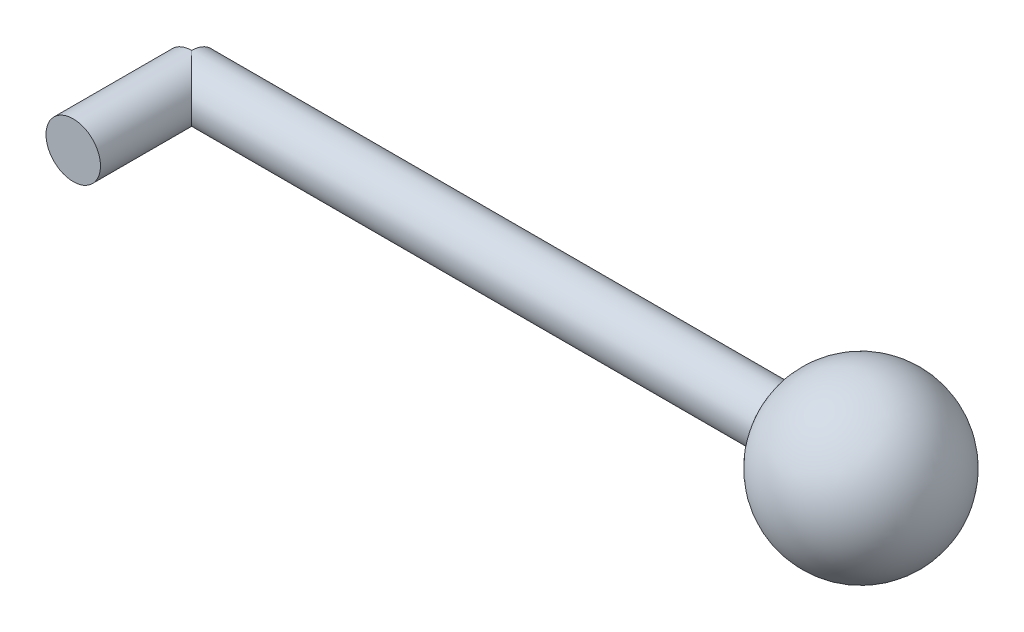
ISO-10303-21;
HEADER;
FILE_DESCRIPTION(('STEP AP214'),'2;1');
FILE_NAME('part.step','',(''),(''),'','','');
FILE_SCHEMA(('AUTOMOTIVE_DESIGN { 1 0 10303 214 1 1 1 1 }'));
ENDSEC;
DATA;
#1=APPLICATION_CONTEXT('core data for automotive mechanical design processes');
#2=APPLICATION_PROTOCOL_DEFINITION('international standard','automotive_design',2000,#1);
#3=PRODUCT_CONTEXT('',#1,'mechanical');
#4=PRODUCT('Part','Part','',(#3));
#5=PRODUCT_RELATED_PRODUCT_CATEGORY('part','',(#4));
#6=PRODUCT_DEFINITION_FORMATION('','',#4);
#7=PRODUCT_DEFINITION_CONTEXT('part definition',#1,'design');
#8=PRODUCT_DEFINITION('design','',#6,#7);
#9=PRODUCT_DEFINITION_SHAPE('','',#8);
#10=(LENGTH_UNIT() NAMED_UNIT(*) SI_UNIT(.MILLI.,.METRE.));
#11=(NAMED_UNIT(*) PLANE_ANGLE_UNIT() SI_UNIT($,.RADIAN.));
#12=(NAMED_UNIT(*) SI_UNIT($,.STERADIAN.) SOLID_ANGLE_UNIT());
#13=UNCERTAINTY_MEASURE_WITH_UNIT(LENGTH_MEASURE(1.E-05),#10,'distance_accuracy_value','');
#14=(GEOMETRIC_REPRESENTATION_CONTEXT(3) GLOBAL_UNCERTAINTY_ASSIGNED_CONTEXT((#13)) GLOBAL_UNIT_ASSIGNED_CONTEXT((#10,
#11,#12)) REPRESENTATION_CONTEXT('',''));
#15=CARTESIAN_POINT('',(0.,0.,0.));
#16=DIRECTION('',(0.,0.,1.));
#17=DIRECTION('',(1.,0.,0.));
#18=AXIS2_PLACEMENT_3D('',#15,#16,#17);
#19=CARTESIAN_POINT('',(565.,0.,0.));
#20=DIRECTION('',(-1.,0.,0.));
#21=DIRECTION('',(0.,0.,1.));
#22=AXIS2_PLACEMENT_3D('',#19,#20,#21);
#23=CYLINDRICAL_SURFACE('',#22,23.);
#24=CARTESIAN_POINT('',(0.,0.,0.));
#25=DIRECTION('',(-0.707106781186547,0.,0.707106781186547));
#26=DIRECTION('',(-0.707106781186547,0.,-0.707106781186547));
#27=AXIS2_PLACEMENT_3D('',#24,#25,#26);
#28=ELLIPSE('',#27,32.5269119345812,23.);
#29=CARTESIAN_POINT('',(0.,-23.,0.));
#30=VERTEX_POINT('',#29);
#31=CARTESIAN_POINT('',(0.,23.,0.));
#32=VERTEX_POINT('',#31);
#33=EDGE_CURVE('E60',#30,#32,#28,.T.);
#34=ORIENTED_EDGE('',*,*,#33,.F.);
#35=CARTESIAN_POINT('',(0.,0.,0.));
#36=DIRECTION('',(1.,0.,0.));
#37=DIRECTION('',(0.,0.,-1.));
#38=AXIS2_PLACEMENT_3D('',#35,#36,#37);
#39=CIRCLE('',#38,23.);
#40=EDGE_CURVE('E54',#30,#32,#39,.T.);
#41=ORIENTED_EDGE('',*,*,#40,.T.);
#42=EDGE_LOOP('',(#34,#41));
#43=FACE_BOUND('',#42,.T.);
#44=CARTESIAN_POINT('',(498.886461295737,0.,0.));
#45=DIRECTION('',(1.,0.,0.));
#46=DIRECTION('',(0.,0.,-1.));
#47=AXIS2_PLACEMENT_3D('',#44,#45,#46);
#48=CIRCLE('',#47,23.);
#49=CARTESIAN_POINT('',(498.886461295737,0.,-23.));
#50=VERTEX_POINT('',#49);
#51=EDGE_CURVE('E11',#50,#50,#48,.T.);
#52=ORIENTED_EDGE('',*,*,#51,.F.);
#53=EDGE_LOOP('',(#52));
#54=FACE_BOUND('',#53,.T.);
#55=ADVANCED_FACE('F39',(#43,#54),#23,.T.);
#56=CARTESIAN_POINT('',(0.,0.,0.));
#57=DIRECTION('',(1.,0.,0.));
#58=DIRECTION('',(0.,0.,-1.));
#59=AXIS2_PLACEMENT_3D('',#56,#57,#58);
#60=PLANE('',#59);
#61=DIRECTION('',(0.,-1.,0.));
#62=VECTOR('',#61,1.);
#63=CARTESIAN_POINT('',(0.,0.,0.));
#64=LINE('',#63,#62);
#65=EDGE_CURVE('E47',#32,#30,#64,.T.);
#66=ORIENTED_EDGE('',*,*,#65,.F.);
#67=ORIENTED_EDGE('',*,*,#40,.F.);
#68=EDGE_LOOP('',(#66,#67));
#69=FACE_BOUND('',#68,.T.);
#70=ADVANCED_FACE('F56',(#69),#60,.F.);
#71=CARTESIAN_POINT('',(0.,0.,100.));
#72=DIRECTION('',(0.,0.,-1.));
#73=DIRECTION('',(-1.,0.,0.));
#74=AXIS2_PLACEMENT_3D('',#71,#72,#73);
#75=CYLINDRICAL_SURFACE('',#74,23.);
#76=CARTESIAN_POINT('',(0.,0.,100.));
#77=DIRECTION('',(0.,0.,1.));
#78=DIRECTION('',(1.,0.,0.));
#79=AXIS2_PLACEMENT_3D('',#76,#77,#78);
#80=CIRCLE('',#79,23.);
#81=CARTESIAN_POINT('',(23.,0.,100.));
#82=VERTEX_POINT('',#81);
#83=EDGE_CURVE('E67',#82,#82,#80,.T.);
#84=ORIENTED_EDGE('',*,*,#83,.F.);
#85=EDGE_LOOP('',(#84));
#86=FACE_BOUND('',#85,.T.);
#87=CARTESIAN_POINT('',(0.,0.,0.));
#88=DIRECTION('',(0.,0.,1.));
#89=DIRECTION('',(1.,0.,0.));
#90=AXIS2_PLACEMENT_3D('',#87,#88,#89);
#91=CIRCLE('',#90,23.);
#92=EDGE_CURVE('E71',#32,#30,#91,.T.);
#93=ORIENTED_EDGE('',*,*,#92,.T.);
#94=ORIENTED_EDGE('',*,*,#33,.T.);
#95=EDGE_LOOP('',(#93,#94));
#96=FACE_BOUND('',#95,.T.);
#97=ADVANCED_FACE('F73',(#86,#96),#75,.T.);
#98=CARTESIAN_POINT('',(0.,0.,0.));
#99=DIRECTION('',(0.,0.,1.));
#100=DIRECTION('',(1.,0.,0.));
#101=AXIS2_PLACEMENT_3D('',#98,#99,#100);
#102=PLANE('',#101);
#103=ORIENTED_EDGE('',*,*,#92,.F.);
#104=ORIENTED_EDGE('',*,*,#65,.T.);
#105=EDGE_LOOP('',(#103,#104));
#106=FACE_BOUND('',#105,.T.);
#107=ADVANCED_FACE('F70',(#106),#102,.F.);
#108=CARTESIAN_POINT('',(0.,0.,100.));
#109=DIRECTION('',(0.,0.,1.));
#110=DIRECTION('',(1.,0.,0.));
#111=AXIS2_PLACEMENT_3D('',#108,#109,#110);
#112=PLANE('',#111);
#113=ORIENTED_EDGE('',*,*,#83,.T.);
#114=EDGE_LOOP('',(#113));
#115=FACE_BOUND('',#114,.T.);
#116=ADVANCED_FACE('F81',(#115),#112,.T.);
#117=CARTESIAN_POINT('',(565.,0.,0.));
#118=DIRECTION('',(1.,0.,0.));
#119=DIRECTION('',(0.,-1.,0.));
#120=AXIS2_PLACEMENT_3D('',#117,#118,#119);
#121=SPHERICAL_SURFACE('',#120,70.0000000000001);
#122=ORIENTED_EDGE('',*,*,#51,.T.);
#123=EDGE_LOOP('',(#122));
#124=FACE_BOUND('',#123,.T.);
#125=ADVANCED_FACE('F116',(#124),#121,.T.);
#126=CLOSED_SHELL('',(#55,#70,#97,#107,#116,#125));
#127=MANIFOLD_SOLID_BREP('B2',#126);
#128=ADVANCED_BREP_SHAPE_REPRESENTATION('',(#18,#127),#14);
#129=SHAPE_DEFINITION_REPRESENTATION(#9,#128);
ENDSEC;
END-ISO-10303-21;
